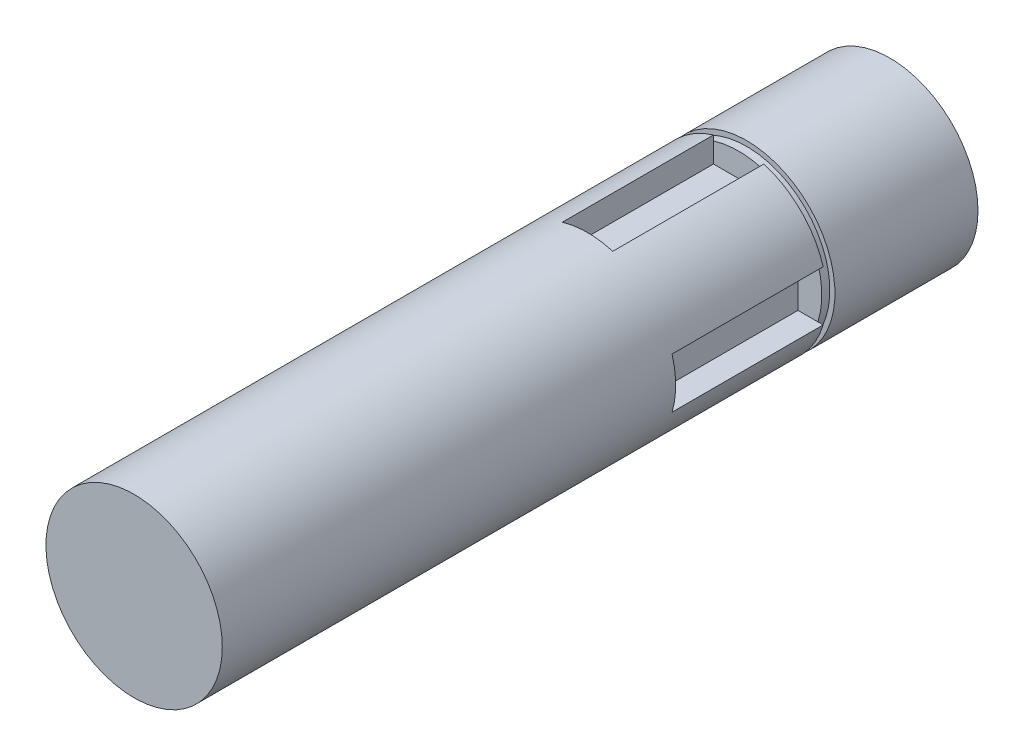
ISO-10303-21;
HEADER;
FILE_DESCRIPTION(('STEP AP214'),'2;1');
FILE_NAME('part.step','',(''),(''),'','','');
FILE_SCHEMA(('AUTOMOTIVE_DESIGN { 1 0 10303 214 1 1 1 1 }'));
ENDSEC;
DATA;
#1=APPLICATION_CONTEXT('core data for automotive mechanical design processes');
#2=APPLICATION_PROTOCOL_DEFINITION('international standard','automotive_design',2000,#1);
#3=PRODUCT_CONTEXT('',#1,'mechanical');
#4=PRODUCT('Part','Part','',(#3));
#5=PRODUCT_RELATED_PRODUCT_CATEGORY('part','',(#4));
#6=PRODUCT_DEFINITION_FORMATION('','',#4);
#7=PRODUCT_DEFINITION_CONTEXT('part definition',#1,'design');
#8=PRODUCT_DEFINITION('design','',#6,#7);
#9=PRODUCT_DEFINITION_SHAPE('','',#8);
#10=(LENGTH_UNIT() NAMED_UNIT(*) SI_UNIT(.MILLI.,.METRE.));
#11=(NAMED_UNIT(*) PLANE_ANGLE_UNIT() SI_UNIT($,.RADIAN.));
#12=(NAMED_UNIT(*) SI_UNIT($,.STERADIAN.) SOLID_ANGLE_UNIT());
#13=UNCERTAINTY_MEASURE_WITH_UNIT(LENGTH_MEASURE(1.E-05),#10,'distance_accuracy_value','');
#14=(GEOMETRIC_REPRESENTATION_CONTEXT(3) GLOBAL_UNCERTAINTY_ASSIGNED_CONTEXT((#13)) GLOBAL_UNIT_ASSIGNED_CONTEXT((#10,
#11,#12)) REPRESENTATION_CONTEXT('',''));
#15=CARTESIAN_POINT('',(0.,0.,0.));
#16=DIRECTION('',(0.,0.,1.));
#17=DIRECTION('',(1.,0.,0.));
#18=AXIS2_PLACEMENT_3D('',#15,#16,#17);
#19=CARTESIAN_POINT('',(0.,0.,150.));
#20=DIRECTION('',(0.,0.,-1.));
#21=DIRECTION('',(-1.,0.,0.));
#22=AXIS2_PLACEMENT_3D('',#19,#20,#21);
#23=CYLINDRICAL_SURFACE('',#22,17.5);
#24=DIRECTION('',(0.,0.,-1.));
#25=VECTOR('',#24,1.);
#26=CARTESIAN_POINT('',(16.7705098312484,5.00000000000001,60.));
#27=LINE('',#26,#25);
#28=CARTESIAN_POINT('',(16.7705098312484,5.00000000000001,60.));
#29=VERTEX_POINT('',#28);
#30=CARTESIAN_POINT('',(16.7705098312484,5.00000000000001,30.));
#31=VERTEX_POINT('',#30);
#32=EDGE_CURVE('E129',#29,#31,#27,.T.);
#33=ORIENTED_EDGE('',*,*,#32,.T.);
#34=CARTESIAN_POINT('',(0.,0.,30.));
#35=DIRECTION('',(0.,0.,-1.));
#36=DIRECTION('',(-1.,0.,0.));
#37=AXIS2_PLACEMENT_3D('',#34,#35,#36);
#38=CIRCLE('',#37,17.5);
#39=CARTESIAN_POINT('',(5.,16.7705098312484,30.));
#40=VERTEX_POINT('',#39);
#41=EDGE_CURVE('E201',#40,#31,#38,.T.);
#42=ORIENTED_EDGE('',*,*,#41,.F.);
#43=DIRECTION('',(0.,0.,-1.));
#44=VECTOR('',#43,1.);
#45=CARTESIAN_POINT('',(5.,16.7705098312484,60.));
#46=LINE('',#45,#44);
#47=CARTESIAN_POINT('',(5.,16.7705098312484,60.));
#48=VERTEX_POINT('',#47);
#49=EDGE_CURVE('E152',#48,#40,#46,.T.);
#50=ORIENTED_EDGE('',*,*,#49,.F.);
#51=CARTESIAN_POINT('',(0.,0.,60.));
#52=DIRECTION('',(0.,0.,1.));
#53=DIRECTION('',(-1.,0.,0.));
#54=AXIS2_PLACEMENT_3D('',#51,#52,#53);
#55=CIRCLE('',#54,17.5);
#56=CARTESIAN_POINT('',(-5.,16.7705098312484,60.));
#57=VERTEX_POINT('',#56);
#58=EDGE_CURVE('E151',#48,#57,#55,.T.);
#59=ORIENTED_EDGE('',*,*,#58,.T.);
#60=DIRECTION('',(0.,0.,-1.));
#61=VECTOR('',#60,1.);
#62=CARTESIAN_POINT('',(-5.,16.7705098312484,60.));
#63=LINE('',#62,#61);
#64=CARTESIAN_POINT('',(-5.,16.7705098312484,30.));
#65=VERTEX_POINT('',#64);
#66=EDGE_CURVE('E159',#57,#65,#63,.T.);
#67=ORIENTED_EDGE('',*,*,#66,.T.);
#68=CARTESIAN_POINT('',(16.7705098312484,-4.99999999999999,30.));
#69=VERTEX_POINT('',#68);
#70=EDGE_CURVE('E217',#69,#65,#38,.T.);
#71=ORIENTED_EDGE('',*,*,#70,.F.);
#72=DIRECTION('',(0.,0.,-1.));
#73=VECTOR('',#72,1.);
#74=CARTESIAN_POINT('',(16.7705098312484,-4.99999999999999,60.));
#75=LINE('',#74,#73);
#76=CARTESIAN_POINT('',(16.7705098312484,-4.99999999999999,60.));
#77=VERTEX_POINT('',#76);
#78=EDGE_CURVE('E112',#77,#69,#75,.T.);
#79=ORIENTED_EDGE('',*,*,#78,.F.);
#80=CARTESIAN_POINT('',(0.,0.,60.));
#81=DIRECTION('',(0.,0.,1.));
#82=DIRECTION('',(-1.,0.,0.));
#83=AXIS2_PLACEMENT_3D('',#80,#81,#82);
#84=CIRCLE('',#83,17.5);
#85=EDGE_CURVE('E119',#77,#29,#84,.T.);
#86=ORIENTED_EDGE('',*,*,#85,.T.);
#87=EDGE_LOOP('',(#33,#42,#50,#59,#67,#71,#79,#86));
#88=FACE_BOUND('',#87,.T.);
#89=CARTESIAN_POINT('',(0.,0.,150.));
#90=DIRECTION('',(0.,0.,1.));
#91=DIRECTION('',(1.,0.,0.));
#92=AXIS2_PLACEMENT_3D('',#89,#90,#91);
#93=CIRCLE('',#92,17.5);
#94=CARTESIAN_POINT('',(17.5,0.,150.));
#95=VERTEX_POINT('',#94);
#96=EDGE_CURVE('E11',#95,#95,#93,.T.);
#97=ORIENTED_EDGE('',*,*,#96,.F.);
#98=EDGE_LOOP('',(#97));
#99=FACE_BOUND('',#98,.T.);
#100=ADVANCED_FACE('F33',(#88,#99),#23,.T.);
#101=CARTESIAN_POINT('',(0.,0.,150.));
#102=DIRECTION('',(0.,0.,1.));
#103=DIRECTION('',(1.,0.,0.));
#104=AXIS2_PLACEMENT_3D('',#101,#102,#103);
#105=PLANE('',#104);
#106=ORIENTED_EDGE('',*,*,#96,.T.);
#107=EDGE_LOOP('',(#106));
#108=FACE_BOUND('',#107,.T.);
#109=ADVANCED_FACE('F225',(#108),#105,.T.);
#110=CARTESIAN_POINT('',(16.7705098312484,5.00000000000001,60.));
#111=DIRECTION('',(0.,-1.,0.));
#112=DIRECTION('',(0.,0.,-1.));
#113=AXIS2_PLACEMENT_3D('',#110,#111,#112);
#114=PLANE('',#113);
#115=DIRECTION('',(-1.,0.,0.));
#116=VECTOR('',#115,1.);
#117=CARTESIAN_POINT('',(16.7705098312484,5.00000000000001,30.));
#118=LINE('',#117,#116);
#119=CARTESIAN_POINT('',(15.7241851935164,5.00000000000001,30.));
#120=VERTEX_POINT('',#119);
#121=EDGE_CURVE('E102',#31,#120,#118,.T.);
#122=ORIENTED_EDGE('',*,*,#121,.F.);
#123=ORIENTED_EDGE('',*,*,#32,.F.);
#124=DIRECTION('',(-1.,0.,0.));
#125=VECTOR('',#124,1.);
#126=CARTESIAN_POINT('',(16.7705098312484,5.00000000000001,60.));
#127=LINE('',#126,#125);
#128=CARTESIAN_POINT('',(11.7705098312484,5.00000000000001,60.));
#129=VERTEX_POINT('',#128);
#130=EDGE_CURVE('E122',#29,#129,#127,.T.);
#131=ORIENTED_EDGE('',*,*,#130,.T.);
#132=DIRECTION('',(0.,0.,-1.));
#133=VECTOR('',#132,1.);
#134=CARTESIAN_POINT('',(11.7705098312484,5.00000000000001,60.));
#135=LINE('',#134,#133);
#136=CARTESIAN_POINT('',(11.7705098312484,5.00000000000001,30.));
#137=VERTEX_POINT('',#136);
#138=EDGE_CURVE('E111',#129,#137,#135,.T.);
#139=ORIENTED_EDGE('',*,*,#138,.T.);
#140=EDGE_CURVE('E98',#120,#137,#118,.T.);
#141=ORIENTED_EDGE('',*,*,#140,.F.);
#142=EDGE_LOOP('',(#122,#123,#131,#139,#141));
#143=FACE_BOUND('',#142,.T.);
#144=ADVANCED_FACE('F223',(#143),#114,.T.);
#145=CARTESIAN_POINT('',(11.7705098312484,5.00000000000001,60.));
#146=DIRECTION('',(1.,0.,0.));
#147=DIRECTION('',(0.,1.,0.));
#148=AXIS2_PLACEMENT_3D('',#145,#146,#147);
#149=PLANE('',#148);
#150=DIRECTION('',(0.,-1.,0.));
#151=VECTOR('',#150,1.);
#152=CARTESIAN_POINT('',(11.7705098312484,5.00000000000001,30.));
#153=LINE('',#152,#151);
#154=CARTESIAN_POINT('',(11.7705098312484,-4.99999999999999,30.));
#155=VERTEX_POINT('',#154);
#156=EDGE_CURVE('E91',#137,#155,#153,.T.);
#157=ORIENTED_EDGE('',*,*,#156,.F.);
#158=ORIENTED_EDGE('',*,*,#138,.F.);
#159=DIRECTION('',(0.,-1.,0.));
#160=VECTOR('',#159,1.);
#161=CARTESIAN_POINT('',(11.7705098312484,5.00000000000001,60.));
#162=LINE('',#161,#160);
#163=CARTESIAN_POINT('',(11.7705098312484,-4.99999999999999,60.));
#164=VERTEX_POINT('',#163);
#165=EDGE_CURVE('E108',#129,#164,#162,.T.);
#166=ORIENTED_EDGE('',*,*,#165,.T.);
#167=DIRECTION('',(0.,0.,-1.));
#168=VECTOR('',#167,1.);
#169=CARTESIAN_POINT('',(11.7705098312484,-4.99999999999999,60.));
#170=LINE('',#169,#168);
#171=EDGE_CURVE('E105',#164,#155,#170,.T.);
#172=ORIENTED_EDGE('',*,*,#171,.T.);
#173=EDGE_LOOP('',(#157,#158,#166,#172));
#174=FACE_BOUND('',#173,.T.);
#175=ADVANCED_FACE('F106',(#174),#149,.T.);
#176=CARTESIAN_POINT('',(11.7705098312484,-4.99999999999999,60.));
#177=DIRECTION('',(0.,1.,0.));
#178=DIRECTION('',(0.,0.,1.));
#179=AXIS2_PLACEMENT_3D('',#176,#177,#178);
#180=PLANE('',#179);
#181=DIRECTION('',(1.,0.,0.));
#182=VECTOR('',#181,1.);
#183=CARTESIAN_POINT('',(11.7705098312484,-4.99999999999999,30.));
#184=LINE('',#183,#182);
#185=CARTESIAN_POINT('',(15.7241851935164,-4.99999999999999,30.));
#186=VERTEX_POINT('',#185);
#187=EDGE_CURVE('E96',#155,#186,#184,.T.);
#188=ORIENTED_EDGE('',*,*,#187,.F.);
#189=ORIENTED_EDGE('',*,*,#171,.F.);
#190=DIRECTION('',(1.,0.,0.));
#191=VECTOR('',#190,1.);
#192=CARTESIAN_POINT('',(11.7705098312484,-4.99999999999999,60.));
#193=LINE('',#192,#191);
#194=EDGE_CURVE('E126',#164,#77,#193,.T.);
#195=ORIENTED_EDGE('',*,*,#194,.T.);
#196=ORIENTED_EDGE('',*,*,#78,.T.);
#197=DIRECTION('',(1.,0.,0.));
#198=VECTOR('',#197,1.);
#199=CARTESIAN_POINT('',(11.7705098312484,-4.99999999999999,30.));
#200=LINE('',#199,#198);
#201=EDGE_CURVE('E118',#186,#69,#200,.T.);
#202=ORIENTED_EDGE('',*,*,#201,.F.);
#203=EDGE_LOOP('',(#188,#189,#195,#196,#202));
#204=FACE_BOUND('',#203,.T.);
#205=ADVANCED_FACE('F115',(#204),#180,.T.);
#206=CARTESIAN_POINT('',(0.,0.,60.));
#207=DIRECTION('',(0.,0.,-1.));
#208=DIRECTION('',(-1.,0.,0.));
#209=AXIS2_PLACEMENT_3D('',#206,#207,#208);
#210=PLANE('',#209);
#211=ORIENTED_EDGE('',*,*,#85,.F.);
#212=ORIENTED_EDGE('',*,*,#194,.F.);
#213=ORIENTED_EDGE('',*,*,#165,.F.);
#214=ORIENTED_EDGE('',*,*,#130,.F.);
#215=EDGE_LOOP('',(#211,#212,#213,#214));
#216=FACE_BOUND('',#215,.T.);
#217=ADVANCED_FACE('F221',(#216),#210,.T.);
#218=CARTESIAN_POINT('',(0.,0.,30.));
#219=DIRECTION('',(0.,0.,-1.));
#220=DIRECTION('',(-1.,0.,0.));
#221=AXIS2_PLACEMENT_3D('',#218,#219,#220);
#222=PLANE('',#221);
#223=ORIENTED_EDGE('',*,*,#187,.T.);
#224=CARTESIAN_POINT('',(0.,0.,30.));
#225=DIRECTION('',(0.,0.,-1.));
#226=DIRECTION('',(-1.,0.,0.));
#227=AXIS2_PLACEMENT_3D('',#224,#225,#226);
#228=CIRCLE('',#227,16.5);
#229=EDGE_CURVE('E387',#120,#186,#228,.T.);
#230=ORIENTED_EDGE('',*,*,#229,.F.);
#231=ORIENTED_EDGE('',*,*,#140,.T.);
#232=ORIENTED_EDGE('',*,*,#156,.T.);
#233=EDGE_LOOP('',(#223,#230,#231,#232));
#234=FACE_BOUND('',#233,.T.);
#235=ADVANCED_FACE('F93',(#234),#222,.F.);
#236=CARTESIAN_POINT('',(-5.,16.7705098312484,60.));
#237=DIRECTION('',(1.,0.,0.));
#238=DIRECTION('',(0.,0.,-1.));
#239=AXIS2_PLACEMENT_3D('',#236,#237,#238);
#240=PLANE('',#239);
#241=DIRECTION('',(0.,-1.,0.));
#242=VECTOR('',#241,1.);
#243=CARTESIAN_POINT('',(-5.,16.7705098312484,30.));
#244=LINE('',#243,#242);
#245=CARTESIAN_POINT('',(-5.,15.7241851935164,30.));
#246=VERTEX_POINT('',#245);
#247=EDGE_CURVE('E136',#65,#246,#244,.T.);
#248=ORIENTED_EDGE('',*,*,#247,.F.);
#249=ORIENTED_EDGE('',*,*,#66,.F.);
#250=DIRECTION('',(0.,-1.,0.));
#251=VECTOR('',#250,1.);
#252=CARTESIAN_POINT('',(-5.,16.7705098312484,60.));
#253=LINE('',#252,#251);
#254=CARTESIAN_POINT('',(-5.,11.7705098312484,60.));
#255=VERTEX_POINT('',#254);
#256=EDGE_CURVE('E183',#57,#255,#253,.T.);
#257=ORIENTED_EDGE('',*,*,#256,.T.);
#258=DIRECTION('',(0.,0.,-1.));
#259=VECTOR('',#258,1.);
#260=CARTESIAN_POINT('',(-5.,11.7705098312484,60.));
#261=LINE('',#260,#259);
#262=CARTESIAN_POINT('',(-5.,11.7705098312484,30.));
#263=VERTEX_POINT('',#262);
#264=EDGE_CURVE('E157',#255,#263,#261,.T.);
#265=ORIENTED_EDGE('',*,*,#264,.T.);
#266=EDGE_CURVE('E131',#246,#263,#244,.T.);
#267=ORIENTED_EDGE('',*,*,#266,.F.);
#268=EDGE_LOOP('',(#248,#249,#257,#265,#267));
#269=FACE_BOUND('',#268,.T.);
#270=ADVANCED_FACE('F215',(#269),#240,.T.);
#271=CARTESIAN_POINT('',(-5.,11.7705098312484,60.));
#272=DIRECTION('',(0.,1.,0.));
#273=DIRECTION('',(0.,0.,1.));
#274=AXIS2_PLACEMENT_3D('',#271,#272,#273);
#275=PLANE('',#274);
#276=DIRECTION('',(1.,0.,0.));
#277=VECTOR('',#276,1.);
#278=CARTESIAN_POINT('',(-5.,11.7705098312484,30.));
#279=LINE('',#278,#277);
#280=CARTESIAN_POINT('',(5.,11.7705098312484,30.));
#281=VERTEX_POINT('',#280);
#282=EDGE_CURVE('E142',#263,#281,#279,.T.);
#283=ORIENTED_EDGE('',*,*,#282,.F.);
#284=ORIENTED_EDGE('',*,*,#264,.F.);
#285=DIRECTION('',(1.,0.,0.));
#286=VECTOR('',#285,1.);
#287=CARTESIAN_POINT('',(-5.,11.7705098312484,60.));
#288=LINE('',#287,#286);
#289=CARTESIAN_POINT('',(5.,11.7705098312484,60.));
#290=VERTEX_POINT('',#289);
#291=EDGE_CURVE('E185',#255,#290,#288,.T.);
#292=ORIENTED_EDGE('',*,*,#291,.T.);
#293=DIRECTION('',(0.,0.,-1.));
#294=VECTOR('',#293,1.);
#295=CARTESIAN_POINT('',(5.,11.7705098312484,60.));
#296=LINE('',#295,#294);
#297=EDGE_CURVE('E154',#290,#281,#296,.T.);
#298=ORIENTED_EDGE('',*,*,#297,.T.);
#299=EDGE_LOOP('',(#283,#284,#292,#298));
#300=FACE_BOUND('',#299,.T.);
#301=ADVANCED_FACE('F190',(#300),#275,.T.);
#302=CARTESIAN_POINT('',(5.,11.7705098312484,60.));
#303=DIRECTION('',(-1.,0.,0.));
#304=DIRECTION('',(0.,0.,1.));
#305=AXIS2_PLACEMENT_3D('',#302,#303,#304);
#306=PLANE('',#305);
#307=DIRECTION('',(0.,1.,0.));
#308=VECTOR('',#307,1.);
#309=CARTESIAN_POINT('',(5.,11.7705098312484,30.));
#310=LINE('',#309,#308);
#311=CARTESIAN_POINT('',(5.,15.7241851935164,30.));
#312=VERTEX_POINT('',#311);
#313=EDGE_CURVE('E148',#281,#312,#310,.T.);
#314=ORIENTED_EDGE('',*,*,#313,.F.);
#315=ORIENTED_EDGE('',*,*,#297,.F.);
#316=DIRECTION('',(0.,1.,0.));
#317=VECTOR('',#316,1.);
#318=CARTESIAN_POINT('',(5.,11.7705098312484,60.));
#319=LINE('',#318,#317);
#320=EDGE_CURVE('E57',#290,#48,#319,.T.);
#321=ORIENTED_EDGE('',*,*,#320,.T.);
#322=ORIENTED_EDGE('',*,*,#49,.T.);
#323=EDGE_CURVE('E147',#312,#40,#310,.T.);
#324=ORIENTED_EDGE('',*,*,#323,.F.);
#325=EDGE_LOOP('',(#314,#315,#321,#322,#324));
#326=FACE_BOUND('',#325,.T.);
#327=ADVANCED_FACE('F194',(#326),#306,.T.);
#328=CARTESIAN_POINT('',(0.,0.,60.));
#329=DIRECTION('',(0.,0.,-1.));
#330=DIRECTION('',(-1.,0.,0.));
#331=AXIS2_PLACEMENT_3D('',#328,#329,#330);
#332=PLANE('',#331);
#333=ORIENTED_EDGE('',*,*,#58,.F.);
#334=ORIENTED_EDGE('',*,*,#320,.F.);
#335=ORIENTED_EDGE('',*,*,#291,.F.);
#336=ORIENTED_EDGE('',*,*,#256,.F.);
#337=EDGE_LOOP('',(#333,#334,#335,#336));
#338=FACE_BOUND('',#337,.T.);
#339=ADVANCED_FACE('F196',(#338),#332,.T.);
#340=CARTESIAN_POINT('',(0.,0.,30.));
#341=DIRECTION('',(0.,0.,-1.));
#342=DIRECTION('',(-1.,0.,0.));
#343=AXIS2_PLACEMENT_3D('',#340,#341,#342);
#344=PLANE('',#343);
#345=ORIENTED_EDGE('',*,*,#313,.T.);
#346=EDGE_CURVE('E171',#246,#312,#228,.T.);
#347=ORIENTED_EDGE('',*,*,#346,.F.);
#348=ORIENTED_EDGE('',*,*,#266,.T.);
#349=ORIENTED_EDGE('',*,*,#282,.T.);
#350=EDGE_LOOP('',(#345,#347,#348,#349));
#351=FACE_BOUND('',#350,.T.);
#352=ADVANCED_FACE('F258',(#351),#344,.F.);
#353=CARTESIAN_POINT('',(0.,17.5,30.));
#354=DIRECTION('',(0.,0.,1.));
#355=DIRECTION('',(1.,0.,0.));
#356=AXIS2_PLACEMENT_3D('',#353,#354,#355);
#357=PLANE('',#356);
#358=ORIENTED_EDGE('',*,*,#121,.T.);
#359=EDGE_CURVE('E177',#312,#120,#228,.T.);
#360=ORIENTED_EDGE('',*,*,#359,.F.);
#361=ORIENTED_EDGE('',*,*,#323,.T.);
#362=ORIENTED_EDGE('',*,*,#41,.T.);
#363=EDGE_LOOP('',(#358,#360,#361,#362));
#364=FACE_BOUND('',#363,.T.);
#365=ADVANCED_FACE('F255',(#364),#357,.F.);
#366=ORIENTED_EDGE('',*,*,#201,.T.);
#367=ORIENTED_EDGE('',*,*,#70,.T.);
#368=ORIENTED_EDGE('',*,*,#247,.T.);
#369=EDGE_CURVE('E48',#186,#246,#228,.T.);
#370=ORIENTED_EDGE('',*,*,#369,.F.);
#371=EDGE_LOOP('',(#366,#367,#368,#370));
#372=FACE_BOUND('',#371,.T.);
#373=ADVANCED_FACE('F257',(#372),#357,.F.);
#374=CARTESIAN_POINT('',(0.,0.,0.));
#375=DIRECTION('',(0.,0.,-1.));
#376=DIRECTION('',(-1.,0.,0.));
#377=AXIS2_PLACEMENT_3D('',#374,#375,#376);
#378=CYLINDRICAL_SURFACE('',#377,16.5);
#379=CARTESIAN_POINT('',(0.,0.,28.4));
#380=DIRECTION('',(0.,0.,-1.));
#381=DIRECTION('',(-1.,0.,0.));
#382=AXIS2_PLACEMENT_3D('',#379,#380,#381);
#383=CIRCLE('',#382,16.5);
#384=CARTESIAN_POINT('',(-16.5,0.,28.4));
#385=VERTEX_POINT('',#384);
#386=EDGE_CURVE('E252',#385,#385,#383,.T.);
#387=ORIENTED_EDGE('',*,*,#386,.F.);
#388=EDGE_LOOP('',(#387));
#389=FACE_BOUND('',#388,.T.);
#390=ORIENTED_EDGE('',*,*,#346,.T.);
#391=ORIENTED_EDGE('',*,*,#359,.T.);
#392=ORIENTED_EDGE('',*,*,#229,.T.);
#393=ORIENTED_EDGE('',*,*,#369,.T.);
#394=EDGE_LOOP('',(#390,#391,#392,#393));
#395=FACE_BOUND('',#394,.T.);
#396=ADVANCED_FACE('F264',(#389,#395),#378,.T.);
#397=CARTESIAN_POINT('',(0.,17.5,28.4));
#398=DIRECTION('',(0.,0.,-1.));
#399=DIRECTION('',(-1.,0.,0.));
#400=AXIS2_PLACEMENT_3D('',#397,#398,#399);
#401=PLANE('',#400);
#402=CARTESIAN_POINT('',(0.,0.,28.4));
#403=DIRECTION('',(0.,0.,-1.));
#404=DIRECTION('',(-1.,0.,0.));
#405=AXIS2_PLACEMENT_3D('',#402,#403,#404);
#406=CIRCLE('',#405,17.5);
#407=CARTESIAN_POINT('',(-17.5,0.,28.4));
#408=VERTEX_POINT('',#407);
#409=EDGE_CURVE('E248',#408,#408,#406,.T.);
#410=ORIENTED_EDGE('',*,*,#409,.F.);
#411=EDGE_LOOP('',(#410));
#412=FACE_BOUND('',#411,.T.);
#413=ORIENTED_EDGE('',*,*,#386,.T.);
#414=EDGE_LOOP('',(#413));
#415=FACE_BOUND('',#414,.T.);
#416=ADVANCED_FACE('F243',(#412,#415),#401,.F.);
#417=CARTESIAN_POINT('',(0.,0.,0.));
#418=DIRECTION('',(0.,0.,1.));
#419=DIRECTION('',(1.,0.,0.));
#420=AXIS2_PLACEMENT_3D('',#417,#418,#419);
#421=PLANE('',#420);
#422=CARTESIAN_POINT('',(0.,0.,0.));
#423=DIRECTION('',(0.,0.,1.));
#424=DIRECTION('',(1.,0.,0.));
#425=AXIS2_PLACEMENT_3D('',#422,#423,#424);
#426=CIRCLE('',#425,17.5);
#427=CARTESIAN_POINT('',(17.5,0.,0.));
#428=VERTEX_POINT('',#427);
#429=EDGE_CURVE('E37',#428,#428,#426,.T.);
#430=ORIENTED_EDGE('',*,*,#429,.F.);
#431=EDGE_LOOP('',(#430));
#432=FACE_BOUND('',#431,.T.);
#433=ADVANCED_FACE('F238',(#432),#421,.F.);
#434=ORIENTED_EDGE('',*,*,#409,.T.);
#435=EDGE_LOOP('',(#434));
#436=FACE_BOUND('',#435,.T.);
#437=ORIENTED_EDGE('',*,*,#429,.T.);
#438=EDGE_LOOP('',(#437));
#439=FACE_BOUND('',#438,.T.);
#440=ADVANCED_FACE('F35',(#436,#439),#23,.T.);
#441=CLOSED_SHELL('',(#100,#109,#144,#175,#205,#217,#235,#270,#301,#327,#339,#352,#365,#373,
#396,#416,#433,#440));
#442=MANIFOLD_SOLID_BREP('B2',#441);
#443=ADVANCED_BREP_SHAPE_REPRESENTATION('',(#18,#442),#14);
#444=SHAPE_DEFINITION_REPRESENTATION(#9,#443);
ENDSEC;
END-ISO-10303-21;
